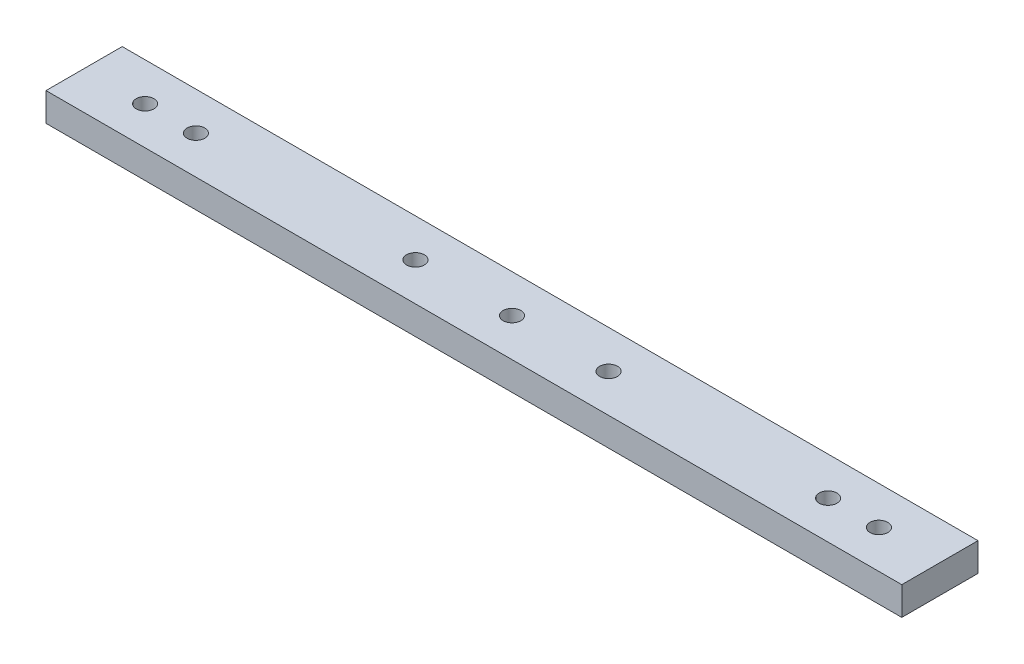
ISO-10303-21;
HEADER;
FILE_DESCRIPTION(('STEP AP214'),'2;1');
FILE_NAME('part.step','',(''),(''),'','','');
FILE_SCHEMA(('AUTOMOTIVE_DESIGN { 1 0 10303 214 1 1 1 1 }'));
ENDSEC;
DATA;
#1=APPLICATION_CONTEXT('core data for automotive mechanical design processes');
#2=APPLICATION_PROTOCOL_DEFINITION('international standard','automotive_design',2000,#1);
#3=PRODUCT_CONTEXT('',#1,'mechanical');
#4=PRODUCT('Part','Part','',(#3));
#5=PRODUCT_RELATED_PRODUCT_CATEGORY('part','',(#4));
#6=PRODUCT_DEFINITION_FORMATION('','',#4);
#7=PRODUCT_DEFINITION_CONTEXT('part definition',#1,'design');
#8=PRODUCT_DEFINITION('design','',#6,#7);
#9=PRODUCT_DEFINITION_SHAPE('','',#8);
#10=(LENGTH_UNIT() NAMED_UNIT(*) SI_UNIT(.MILLI.,.METRE.));
#11=(NAMED_UNIT(*) PLANE_ANGLE_UNIT() SI_UNIT($,.RADIAN.));
#12=(NAMED_UNIT(*) SI_UNIT($,.STERADIAN.) SOLID_ANGLE_UNIT());
#13=UNCERTAINTY_MEASURE_WITH_UNIT(LENGTH_MEASURE(1.E-05),#10,'distance_accuracy_value','');
#14=(GEOMETRIC_REPRESENTATION_CONTEXT(3) GLOBAL_UNCERTAINTY_ASSIGNED_CONTEXT((#13)) GLOBAL_UNIT_ASSIGNED_CONTEXT((#10,
#11,#12)) REPRESENTATION_CONTEXT('',''));
#15=CARTESIAN_POINT('',(0.,0.,0.));
#16=DIRECTION('',(0.,0.,1.));
#17=DIRECTION('',(1.,0.,0.));
#18=AXIS2_PLACEMENT_3D('',#15,#16,#17);
#19=CARTESIAN_POINT('',(-71.3549150414053,5.588,2.97081892022286));
#20=DIRECTION('',(1.,0.,0.));
#21=DIRECTION('',(0.,0.,-1.));
#22=AXIS2_PLACEMENT_3D('',#19,#20,#21);
#23=PLANE('',#22);
#24=DIRECTION('',(0.,0.,1.));
#25=VECTOR('',#24,1.);
#26=CARTESIAN_POINT('',(-71.3549150414053,0.,2.97081892022286));
#27=LINE('',#26,#25);
#28=CARTESIAN_POINT('',(-71.3549150414053,0.,-12.0291810797771));
#29=VERTEX_POINT('',#28);
#30=CARTESIAN_POINT('',(-71.3549150414053,0.,2.97081892022286));
#31=VERTEX_POINT('',#30);
#32=EDGE_CURVE('E96',#29,#31,#27,.T.);
#33=ORIENTED_EDGE('',*,*,#32,.T.);
#34=DIRECTION('',(0.,-1.,0.));
#35=VECTOR('',#34,1.);
#36=CARTESIAN_POINT('',(-71.3549150414053,5.588,2.97081892022286));
#37=LINE('',#36,#35);
#38=CARTESIAN_POINT('',(-71.3549150414053,5.588,2.97081892022286));
#39=VERTEX_POINT('',#38);
#40=EDGE_CURVE('E11',#39,#31,#37,.T.);
#41=ORIENTED_EDGE('',*,*,#40,.F.);
#42=DIRECTION('',(0.,0.,1.));
#43=VECTOR('',#42,1.);
#44=CARTESIAN_POINT('',(-71.3549150414053,5.588,2.97081892022286));
#45=LINE('',#44,#43);
#46=CARTESIAN_POINT('',(-71.3549150414053,5.588,-12.0291810797771));
#47=VERTEX_POINT('',#46);
#48=EDGE_CURVE('E84',#47,#39,#45,.T.);
#49=ORIENTED_EDGE('',*,*,#48,.F.);
#50=DIRECTION('',(0.,-1.,0.));
#51=VECTOR('',#50,1.);
#52=CARTESIAN_POINT('',(-71.3549150414053,5.588,-12.0291810797771));
#53=LINE('',#52,#51);
#54=EDGE_CURVE('E92',#47,#29,#53,.T.);
#55=ORIENTED_EDGE('',*,*,#54,.T.);
#56=EDGE_LOOP('',(#33,#41,#49,#55));
#57=FACE_BOUND('',#56,.T.);
#58=ADVANCED_FACE('F33',(#57),#23,.F.);
#59=CARTESIAN_POINT('',(-71.3549150414053,5.588,2.97081892022286));
#60=DIRECTION('',(0.,0.,-1.));
#61=DIRECTION('',(-1.,0.,0.));
#62=AXIS2_PLACEMENT_3D('',#59,#60,#61);
#63=PLANE('',#62);
#64=DIRECTION('',(1.,0.,0.));
#65=VECTOR('',#64,1.);
#66=CARTESIAN_POINT('',(-71.3549150414053,0.,2.97081892022286));
#67=LINE('',#66,#65);
#68=CARTESIAN_POINT('',(97.0570849585947,0.,2.97081892022286));
#69=VERTEX_POINT('',#68);
#70=EDGE_CURVE('E88',#31,#69,#67,.T.);
#71=ORIENTED_EDGE('',*,*,#70,.T.);
#72=DIRECTION('',(0.,-1.,0.));
#73=VECTOR('',#72,1.);
#74=CARTESIAN_POINT('',(97.0570849585947,5.588,2.97081892022286));
#75=LINE('',#74,#73);
#76=CARTESIAN_POINT('',(97.0570849585947,5.588,2.97081892022286));
#77=VERTEX_POINT('',#76);
#78=EDGE_CURVE('E41',#77,#69,#75,.T.);
#79=ORIENTED_EDGE('',*,*,#78,.F.);
#80=DIRECTION('',(1.,0.,0.));
#81=VECTOR('',#80,1.);
#82=CARTESIAN_POINT('',(-71.3549150414053,5.588,2.97081892022286));
#83=LINE('',#82,#81);
#84=EDGE_CURVE('E79',#39,#77,#83,.T.);
#85=ORIENTED_EDGE('',*,*,#84,.F.);
#86=ORIENTED_EDGE('',*,*,#40,.T.);
#87=EDGE_LOOP('',(#71,#79,#85,#86));
#88=FACE_BOUND('',#87,.T.);
#89=ADVANCED_FACE('F87',(#88),#63,.F.);
#90=CARTESIAN_POINT('',(97.0570849585947,5.588,2.97081892022286));
#91=DIRECTION('',(-1.,0.,0.));
#92=DIRECTION('',(0.,0.,1.));
#93=AXIS2_PLACEMENT_3D('',#90,#91,#92);
#94=PLANE('',#93);
#95=DIRECTION('',(0.,0.,-1.));
#96=VECTOR('',#95,1.);
#97=CARTESIAN_POINT('',(97.0570849585947,0.,2.97081892022286));
#98=LINE('',#97,#96);
#99=CARTESIAN_POINT('',(97.0570849585947,0.,-12.0291810797771));
#100=VERTEX_POINT('',#99);
#101=EDGE_CURVE('E66',#69,#100,#98,.T.);
#102=ORIENTED_EDGE('',*,*,#101,.T.);
#103=DIRECTION('',(0.,-1.,0.));
#104=VECTOR('',#103,1.);
#105=CARTESIAN_POINT('',(97.0570849585947,5.588,-12.0291810797771));
#106=LINE('',#105,#104);
#107=CARTESIAN_POINT('',(97.0570849585947,5.588,-12.0291810797771));
#108=VERTEX_POINT('',#107);
#109=EDGE_CURVE('E89',#108,#100,#106,.T.);
#110=ORIENTED_EDGE('',*,*,#109,.F.);
#111=DIRECTION('',(0.,0.,-1.));
#112=VECTOR('',#111,1.);
#113=CARTESIAN_POINT('',(97.0570849585947,5.588,2.97081892022286));
#114=LINE('',#113,#112);
#115=EDGE_CURVE('E82',#77,#108,#114,.T.);
#116=ORIENTED_EDGE('',*,*,#115,.F.);
#117=ORIENTED_EDGE('',*,*,#78,.T.);
#118=EDGE_LOOP('',(#102,#110,#116,#117));
#119=FACE_BOUND('',#118,.T.);
#120=ADVANCED_FACE('F90',(#119),#94,.F.);
#121=CARTESIAN_POINT('',(-71.3549150414053,5.588,-12.0291810797771));
#122=DIRECTION('',(0.,0.,1.));
#123=DIRECTION('',(1.,0.,0.));
#124=AXIS2_PLACEMENT_3D('',#121,#122,#123);
#125=PLANE('',#124);
#126=DIRECTION('',(-1.,0.,0.));
#127=VECTOR('',#126,1.);
#128=CARTESIAN_POINT('',(-71.3549150414053,0.,-12.0291810797771));
#129=LINE('',#128,#127);
#130=EDGE_CURVE('E72',#100,#29,#129,.T.);
#131=ORIENTED_EDGE('',*,*,#130,.T.);
#132=ORIENTED_EDGE('',*,*,#54,.F.);
#133=DIRECTION('',(-1.,0.,0.));
#134=VECTOR('',#133,1.);
#135=CARTESIAN_POINT('',(-71.3549150414053,5.588,-12.0291810797771));
#136=LINE('',#135,#134);
#137=EDGE_CURVE('E49',#108,#47,#136,.T.);
#138=ORIENTED_EDGE('',*,*,#137,.F.);
#139=ORIENTED_EDGE('',*,*,#109,.T.);
#140=EDGE_LOOP('',(#131,#132,#138,#139));
#141=FACE_BOUND('',#140,.T.);
#142=ADVANCED_FACE('F104',(#141),#125,.F.);
#143=CARTESIAN_POINT('',(0.,5.588,0.));
#144=DIRECTION('',(0.,-1.,0.));
#145=DIRECTION('',(0.,0.,-1.));
#146=AXIS2_PLACEMENT_3D('',#143,#144,#145);
#147=PLANE('',#146);
#148=CARTESIAN_POINT('',(12.8510849585947,5.588,-4.52918107977712));
#149=DIRECTION('',(0.,1.,0.));
#150=DIRECTION('',(0.,0.,1.));
#151=AXIS2_PLACEMENT_3D('',#148,#149,#150);
#152=CIRCLE('',#151,1.75);
#153=CARTESIAN_POINT('',(12.8510849585947,5.588,-2.77918107977712));
#154=VERTEX_POINT('',#153);
#155=EDGE_CURVE('E146',#154,#154,#152,.T.);
#156=ORIENTED_EDGE('',*,*,#155,.F.);
#157=EDGE_LOOP('',(#156));
#158=FACE_BOUND('',#157,.T.);
#159=CARTESIAN_POINT('',(31.8510849585947,5.588,-4.52918107977713));
#160=DIRECTION('',(0.,1.,0.));
#161=DIRECTION('',(0.,0.,1.));
#162=AXIS2_PLACEMENT_3D('',#159,#160,#161);
#163=CIRCLE('',#162,1.75);
#164=CARTESIAN_POINT('',(31.8510849585947,5.588,-2.77918107977713));
#165=VERTEX_POINT('',#164);
#166=EDGE_CURVE('E140',#165,#165,#163,.T.);
#167=ORIENTED_EDGE('',*,*,#166,.F.);
#168=EDGE_LOOP('',(#167));
#169=FACE_BOUND('',#168,.T.);
#170=CARTESIAN_POINT('',(-6.14891504140531,5.588,-4.52918107977712));
#171=DIRECTION('',(0.,1.,0.));
#172=DIRECTION('',(0.,0.,1.));
#173=AXIS2_PLACEMENT_3D('',#170,#171,#172);
#174=CIRCLE('',#173,1.75);
#175=CARTESIAN_POINT('',(-6.14891504140531,5.588,-2.77918107977712));
#176=VERTEX_POINT('',#175);
#177=EDGE_CURVE('E134',#176,#176,#174,.T.);
#178=ORIENTED_EDGE('',*,*,#177,.F.);
#179=EDGE_LOOP('',(#178));
#180=FACE_BOUND('',#179,.T.);
#181=CARTESIAN_POINT('',(85.0570849585947,5.588,-4.52918107977714));
#182=DIRECTION('',(0.,1.,0.));
#183=DIRECTION('',(0.,0.,1.));
#184=AXIS2_PLACEMENT_3D('',#181,#182,#183);
#185=CIRCLE('',#184,1.75);
#186=CARTESIAN_POINT('',(85.0570849585947,5.588,-2.77918107977715));
#187=VERTEX_POINT('',#186);
#188=EDGE_CURVE('E128',#187,#187,#185,.T.);
#189=ORIENTED_EDGE('',*,*,#188,.F.);
#190=EDGE_LOOP('',(#189));
#191=FACE_BOUND('',#190,.T.);
#192=CARTESIAN_POINT('',(75.0570849585947,5.588,-4.52918107977714));
#193=DIRECTION('',(0.,1.,0.));
#194=DIRECTION('',(0.,0.,1.));
#195=AXIS2_PLACEMENT_3D('',#192,#193,#194);
#196=CIRCLE('',#195,1.75);
#197=CARTESIAN_POINT('',(75.0570849585947,5.588,-2.77918107977715));
#198=VERTEX_POINT('',#197);
#199=EDGE_CURVE('E122',#198,#198,#196,.T.);
#200=ORIENTED_EDGE('',*,*,#199,.F.);
#201=EDGE_LOOP('',(#200));
#202=FACE_BOUND('',#201,.T.);
#203=CARTESIAN_POINT('',(-49.3549150414053,5.588,-4.52918107977714));
#204=DIRECTION('',(0.,1.,0.));
#205=DIRECTION('',(0.,0.,1.));
#206=AXIS2_PLACEMENT_3D('',#203,#204,#205);
#207=CIRCLE('',#206,1.75);
#208=CARTESIAN_POINT('',(-49.3549150414053,5.588,-2.77918107977714));
#209=VERTEX_POINT('',#208);
#210=EDGE_CURVE('E116',#209,#209,#207,.T.);
#211=ORIENTED_EDGE('',*,*,#210,.F.);
#212=EDGE_LOOP('',(#211));
#213=FACE_BOUND('',#212,.T.);
#214=CARTESIAN_POINT('',(-59.3549150414053,5.588,-4.52918107977714));
#215=DIRECTION('',(0.,1.,0.));
#216=DIRECTION('',(0.,0.,1.));
#217=AXIS2_PLACEMENT_3D('',#214,#215,#216);
#218=CIRCLE('',#217,1.75);
#219=CARTESIAN_POINT('',(-59.3549150414053,5.588,-2.77918107977715));
#220=VERTEX_POINT('',#219);
#221=EDGE_CURVE('E110',#220,#220,#218,.T.);
#222=ORIENTED_EDGE('',*,*,#221,.F.);
#223=EDGE_LOOP('',(#222));
#224=FACE_BOUND('',#223,.T.);
#225=ORIENTED_EDGE('',*,*,#48,.T.);
#226=ORIENTED_EDGE('',*,*,#84,.T.);
#227=ORIENTED_EDGE('',*,*,#115,.T.);
#228=ORIENTED_EDGE('',*,*,#137,.T.);
#229=EDGE_LOOP('',(#225,#226,#227,#228));
#230=FACE_BOUND('',#229,.T.);
#231=ADVANCED_FACE('F80',(#158,#169,#180,#191,#202,#213,#224,#230),#147,.F.);
#232=CARTESIAN_POINT('',(0.,0.,0.));
#233=DIRECTION('',(0.,-1.,0.));
#234=DIRECTION('',(0.,0.,-1.));
#235=AXIS2_PLACEMENT_3D('',#232,#233,#234);
#236=PLANE('',#235);
#237=CARTESIAN_POINT('',(12.8510849585947,0.,-4.52918107977712));
#238=DIRECTION('',(0.,1.,0.));
#239=DIRECTION('',(0.,0.,1.));
#240=AXIS2_PLACEMENT_3D('',#237,#238,#239);
#241=CIRCLE('',#240,1.75);
#242=CARTESIAN_POINT('',(12.8510849585947,0.,-2.77918107977712));
#243=VERTEX_POINT('',#242);
#244=EDGE_CURVE('E143',#243,#243,#241,.T.);
#245=ORIENTED_EDGE('',*,*,#244,.T.);
#246=EDGE_LOOP('',(#245));
#247=FACE_BOUND('',#246,.T.);
#248=CARTESIAN_POINT('',(31.8510849585947,0.,-4.52918107977713));
#249=DIRECTION('',(0.,1.,0.));
#250=DIRECTION('',(0.,0.,1.));
#251=AXIS2_PLACEMENT_3D('',#248,#249,#250);
#252=CIRCLE('',#251,1.75);
#253=CARTESIAN_POINT('',(31.8510849585947,0.,-2.77918107977713));
#254=VERTEX_POINT('',#253);
#255=EDGE_CURVE('E137',#254,#254,#252,.T.);
#256=ORIENTED_EDGE('',*,*,#255,.T.);
#257=EDGE_LOOP('',(#256));
#258=FACE_BOUND('',#257,.T.);
#259=CARTESIAN_POINT('',(-6.14891504140531,0.,-4.52918107977712));
#260=DIRECTION('',(0.,1.,0.));
#261=DIRECTION('',(0.,0.,1.));
#262=AXIS2_PLACEMENT_3D('',#259,#260,#261);
#263=CIRCLE('',#262,1.75);
#264=CARTESIAN_POINT('',(-6.14891504140531,0.,-2.77918107977712));
#265=VERTEX_POINT('',#264);
#266=EDGE_CURVE('E131',#265,#265,#263,.T.);
#267=ORIENTED_EDGE('',*,*,#266,.T.);
#268=EDGE_LOOP('',(#267));
#269=FACE_BOUND('',#268,.T.);
#270=CARTESIAN_POINT('',(85.0570849585947,0.,-4.52918107977714));
#271=DIRECTION('',(0.,1.,0.));
#272=DIRECTION('',(0.,0.,1.));
#273=AXIS2_PLACEMENT_3D('',#270,#271,#272);
#274=CIRCLE('',#273,1.75);
#275=CARTESIAN_POINT('',(85.0570849585947,0.,-2.77918107977715));
#276=VERTEX_POINT('',#275);
#277=EDGE_CURVE('E125',#276,#276,#274,.T.);
#278=ORIENTED_EDGE('',*,*,#277,.T.);
#279=EDGE_LOOP('',(#278));
#280=FACE_BOUND('',#279,.T.);
#281=CARTESIAN_POINT('',(75.0570849585947,0.,-4.52918107977714));
#282=DIRECTION('',(0.,1.,0.));
#283=DIRECTION('',(0.,0.,1.));
#284=AXIS2_PLACEMENT_3D('',#281,#282,#283);
#285=CIRCLE('',#284,1.75);
#286=CARTESIAN_POINT('',(75.0570849585947,0.,-2.77918107977715));
#287=VERTEX_POINT('',#286);
#288=EDGE_CURVE('E119',#287,#287,#285,.T.);
#289=ORIENTED_EDGE('',*,*,#288,.T.);
#290=EDGE_LOOP('',(#289));
#291=FACE_BOUND('',#290,.T.);
#292=CARTESIAN_POINT('',(-49.3549150414053,0.,-4.52918107977714));
#293=DIRECTION('',(0.,1.,0.));
#294=DIRECTION('',(0.,0.,1.));
#295=AXIS2_PLACEMENT_3D('',#292,#293,#294);
#296=CIRCLE('',#295,1.75);
#297=CARTESIAN_POINT('',(-49.3549150414053,0.,-2.77918107977714));
#298=VERTEX_POINT('',#297);
#299=EDGE_CURVE('E113',#298,#298,#296,.T.);
#300=ORIENTED_EDGE('',*,*,#299,.T.);
#301=EDGE_LOOP('',(#300));
#302=FACE_BOUND('',#301,.T.);
#303=CARTESIAN_POINT('',(-59.3549150414053,0.,-4.52918107977714));
#304=DIRECTION('',(0.,1.,0.));
#305=DIRECTION('',(0.,0.,1.));
#306=AXIS2_PLACEMENT_3D('',#303,#304,#305);
#307=CIRCLE('',#306,1.75);
#308=CARTESIAN_POINT('',(-59.3549150414053,0.,-2.77918107977715));
#309=VERTEX_POINT('',#308);
#310=EDGE_CURVE('E99',#309,#309,#307,.T.);
#311=ORIENTED_EDGE('',*,*,#310,.T.);
#312=EDGE_LOOP('',(#311));
#313=FACE_BOUND('',#312,.T.);
#314=ORIENTED_EDGE('',*,*,#32,.F.);
#315=ORIENTED_EDGE('',*,*,#130,.F.);
#316=ORIENTED_EDGE('',*,*,#101,.F.);
#317=ORIENTED_EDGE('',*,*,#70,.F.);
#318=EDGE_LOOP('',(#314,#315,#316,#317));
#319=FACE_BOUND('',#318,.T.);
#320=ADVANCED_FACE('F107',(#247,#258,#269,#280,#291,#302,#313,#319),#236,.T.);
#321=CARTESIAN_POINT('',(-59.3549150414053,0.,-4.52918107977714));
#322=DIRECTION('',(0.,1.,0.));
#323=DIRECTION('',(0.,0.,1.));
#324=AXIS2_PLACEMENT_3D('',#321,#322,#323);
#325=CYLINDRICAL_SURFACE('',#324,1.75);
#326=ORIENTED_EDGE('',*,*,#310,.F.);
#327=EDGE_LOOP('',(#326));
#328=FACE_BOUND('',#327,.T.);
#329=ORIENTED_EDGE('',*,*,#221,.T.);
#330=EDGE_LOOP('',(#329));
#331=FACE_BOUND('',#330,.T.);
#332=ADVANCED_FACE('F176',(#328,#331),#325,.F.);
#333=CARTESIAN_POINT('',(-49.3549150414053,0.,-4.52918107977714));
#334=DIRECTION('',(0.,1.,0.));
#335=DIRECTION('',(0.,0.,1.));
#336=AXIS2_PLACEMENT_3D('',#333,#334,#335);
#337=CYLINDRICAL_SURFACE('',#336,1.75);
#338=ORIENTED_EDGE('',*,*,#299,.F.);
#339=EDGE_LOOP('',(#338));
#340=FACE_BOUND('',#339,.T.);
#341=ORIENTED_EDGE('',*,*,#210,.T.);
#342=EDGE_LOOP('',(#341));
#343=FACE_BOUND('',#342,.T.);
#344=ADVANCED_FACE('F178',(#340,#343),#337,.F.);
#345=CARTESIAN_POINT('',(75.0570849585947,0.,-4.52918107977714));
#346=DIRECTION('',(0.,1.,0.));
#347=DIRECTION('',(0.,0.,1.));
#348=AXIS2_PLACEMENT_3D('',#345,#346,#347);
#349=CYLINDRICAL_SURFACE('',#348,1.75);
#350=ORIENTED_EDGE('',*,*,#288,.F.);
#351=EDGE_LOOP('',(#350));
#352=FACE_BOUND('',#351,.T.);
#353=ORIENTED_EDGE('',*,*,#199,.T.);
#354=EDGE_LOOP('',(#353));
#355=FACE_BOUND('',#354,.T.);
#356=ADVANCED_FACE('F185',(#352,#355),#349,.F.);
#357=CARTESIAN_POINT('',(85.0570849585947,0.,-4.52918107977714));
#358=DIRECTION('',(0.,1.,0.));
#359=DIRECTION('',(0.,0.,1.));
#360=AXIS2_PLACEMENT_3D('',#357,#358,#359);
#361=CYLINDRICAL_SURFACE('',#360,1.75);
#362=ORIENTED_EDGE('',*,*,#277,.F.);
#363=EDGE_LOOP('',(#362));
#364=FACE_BOUND('',#363,.T.);
#365=ORIENTED_EDGE('',*,*,#188,.T.);
#366=EDGE_LOOP('',(#365));
#367=FACE_BOUND('',#366,.T.);
#368=ADVANCED_FACE('F224',(#364,#367),#361,.F.);
#369=CARTESIAN_POINT('',(-6.14891504140531,0.,-4.52918107977712));
#370=DIRECTION('',(0.,1.,0.));
#371=DIRECTION('',(0.,0.,1.));
#372=AXIS2_PLACEMENT_3D('',#369,#370,#371);
#373=CYLINDRICAL_SURFACE('',#372,1.75);
#374=ORIENTED_EDGE('',*,*,#266,.F.);
#375=EDGE_LOOP('',(#374));
#376=FACE_BOUND('',#375,.T.);
#377=ORIENTED_EDGE('',*,*,#177,.T.);
#378=EDGE_LOOP('',(#377));
#379=FACE_BOUND('',#378,.T.);
#380=ADVANCED_FACE('F219',(#376,#379),#373,.F.);
#381=CARTESIAN_POINT('',(31.8510849585947,0.,-4.52918107977713));
#382=DIRECTION('',(0.,1.,0.));
#383=DIRECTION('',(0.,0.,1.));
#384=AXIS2_PLACEMENT_3D('',#381,#382,#383);
#385=CYLINDRICAL_SURFACE('',#384,1.75);
#386=ORIENTED_EDGE('',*,*,#255,.F.);
#387=EDGE_LOOP('',(#386));
#388=FACE_BOUND('',#387,.T.);
#389=ORIENTED_EDGE('',*,*,#166,.T.);
#390=EDGE_LOOP('',(#389));
#391=FACE_BOUND('',#390,.T.);
#392=ADVANCED_FACE('F157',(#388,#391),#385,.F.);
#393=CARTESIAN_POINT('',(12.8510849585947,0.,-4.52918107977712));
#394=DIRECTION('',(0.,1.,0.));
#395=DIRECTION('',(0.,0.,1.));
#396=AXIS2_PLACEMENT_3D('',#393,#394,#395);
#397=CYLINDRICAL_SURFACE('',#396,1.75);
#398=ORIENTED_EDGE('',*,*,#244,.F.);
#399=EDGE_LOOP('',(#398));
#400=FACE_BOUND('',#399,.T.);
#401=ORIENTED_EDGE('',*,*,#155,.T.);
#402=EDGE_LOOP('',(#401));
#403=FACE_BOUND('',#402,.T.);
#404=ADVANCED_FACE('F154',(#400,#403),#397,.F.);
#405=CLOSED_SHELL('',(#58,#89,#120,#142,#231,#320,#332,#344,#356,#368,#380,#392,#404));
#406=MANIFOLD_SOLID_BREP('B2',#405);
#407=ADVANCED_BREP_SHAPE_REPRESENTATION('',(#18,#406),#14);
#408=SHAPE_DEFINITION_REPRESENTATION(#9,#407);
ENDSEC;
END-ISO-10303-21;
